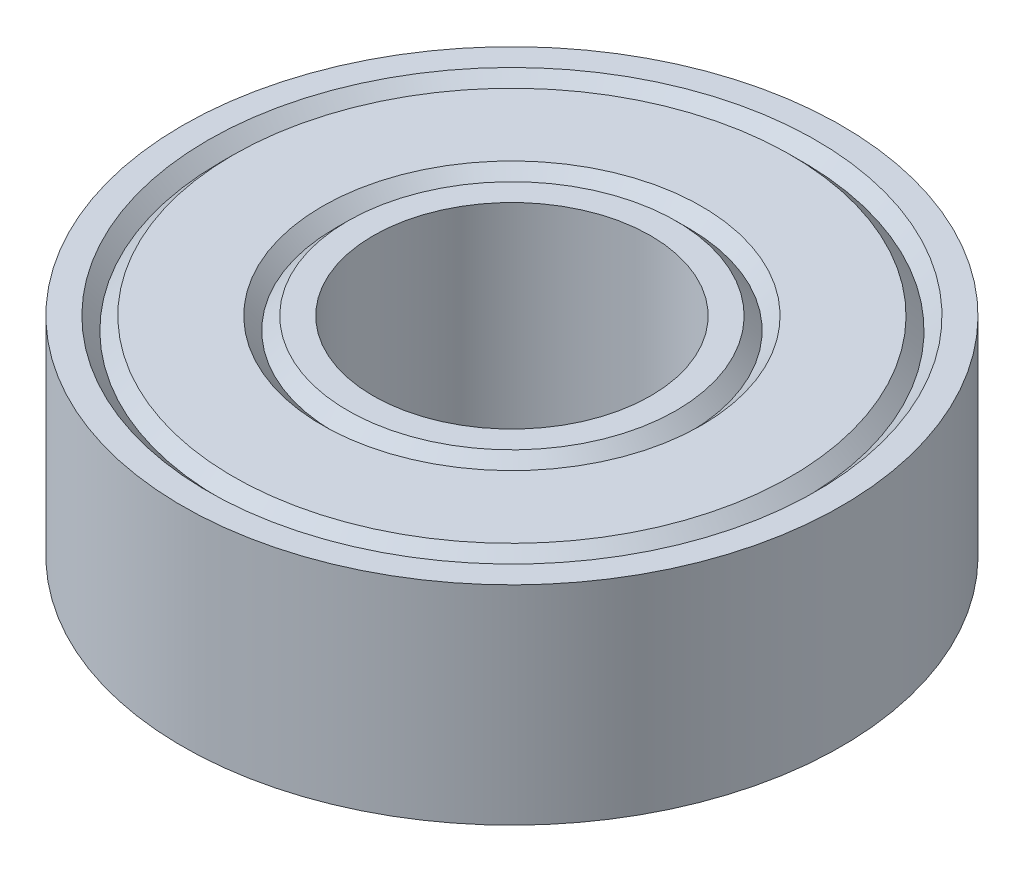
ISO-10303-21;
HEADER;
FILE_DESCRIPTION(('STEP AP214'),'2;1');
FILE_NAME('part.step','',(''),(''),'','','');
FILE_SCHEMA(('AUTOMOTIVE_DESIGN { 1 0 10303 214 1 1 1 1 }'));
ENDSEC;
DATA;
#1=APPLICATION_CONTEXT('core data for automotive mechanical design processes');
#2=APPLICATION_PROTOCOL_DEFINITION('international standard','automotive_design',2000,#1);
#3=PRODUCT_CONTEXT('',#1,'mechanical');
#4=PRODUCT('Part','Part','',(#3));
#5=PRODUCT_RELATED_PRODUCT_CATEGORY('part','',(#4));
#6=PRODUCT_DEFINITION_FORMATION('','',#4);
#7=PRODUCT_DEFINITION_CONTEXT('part definition',#1,'design');
#8=PRODUCT_DEFINITION('design','',#6,#7);
#9=PRODUCT_DEFINITION_SHAPE('','',#8);
#10=(LENGTH_UNIT() NAMED_UNIT(*) SI_UNIT(.MILLI.,.METRE.));
#11=(NAMED_UNIT(*) PLANE_ANGLE_UNIT() SI_UNIT($,.RADIAN.));
#12=(NAMED_UNIT(*) SI_UNIT($,.STERADIAN.) SOLID_ANGLE_UNIT());
#13=UNCERTAINTY_MEASURE_WITH_UNIT(LENGTH_MEASURE(1.E-05),#10,'distance_accuracy_value','');
#14=(GEOMETRIC_REPRESENTATION_CONTEXT(3) GLOBAL_UNCERTAINTY_ASSIGNED_CONTEXT((#13)) GLOBAL_UNIT_ASSIGNED_CONTEXT((#10,
#11,#12)) REPRESENTATION_CONTEXT('',''));
#15=CARTESIAN_POINT('',(0.,0.,0.));
#16=DIRECTION('',(0.,0.,1.));
#17=DIRECTION('',(1.,0.,0.));
#18=AXIS2_PLACEMENT_3D('',#15,#16,#17);
#19=CARTESIAN_POINT('',(0.,3.,0.));
#20=DIRECTION('',(0.,1.,0.));
#21=DIRECTION('',(-1.,0.,0.));
#22=AXIS2_PLACEMENT_3D('',#19,#20,#21);
#23=CYLINDRICAL_SURFACE('',#22,4.);
#24=CARTESIAN_POINT('',(0.,3.00000000000001,0.));
#25=DIRECTION('',(0.,1.,0.));
#26=DIRECTION('',(-1.,0.,0.));
#27=AXIS2_PLACEMENT_3D('',#24,#25,#26);
#28=CIRCLE('',#27,4.);
#29=CARTESIAN_POINT('',(-4.,3.,0.));
#30=VERTEX_POINT('',#29);
#31=EDGE_CURVE('E83',#30,#30,#28,.T.);
#32=ORIENTED_EDGE('',*,*,#31,.T.);
#33=EDGE_LOOP('',(#32));
#34=FACE_BOUND('',#33,.T.);
#35=CARTESIAN_POINT('',(0.,-3.,0.));
#36=DIRECTION('',(0.,1.,0.));
#37=DIRECTION('',(-1.,0.,0.));
#38=AXIS2_PLACEMENT_3D('',#35,#36,#37);
#39=CIRCLE('',#38,4.);
#40=CARTESIAN_POINT('',(-4.,-3.,0.));
#41=VERTEX_POINT('',#40);
#42=EDGE_CURVE('E10',#41,#41,#39,.T.);
#43=ORIENTED_EDGE('',*,*,#42,.F.);
#44=EDGE_LOOP('',(#43));
#45=FACE_BOUND('',#44,.T.);
#46=ADVANCED_FACE('F31',(#34,#45),#23,.F.);
#47=CARTESIAN_POINT('',(-4.,-3.,0.));
#48=DIRECTION('',(0.,-1.,0.));
#49=DIRECTION('',(1.,0.,0.));
#50=AXIS2_PLACEMENT_3D('',#47,#48,#49);
#51=PLANE('',#50);
#52=ORIENTED_EDGE('',*,*,#42,.T.);
#53=EDGE_LOOP('',(#52));
#54=FACE_BOUND('',#53,.T.);
#55=CARTESIAN_POINT('',(0.,-3.,0.));
#56=DIRECTION('',(0.,1.,0.));
#57=DIRECTION('',(-1.,0.,0.));
#58=AXIS2_PLACEMENT_3D('',#55,#56,#57);
#59=CIRCLE('',#58,4.73333333333334);
#60=CARTESIAN_POINT('',(-4.73333333333333,-3.,0.));
#61=VERTEX_POINT('',#60);
#62=EDGE_CURVE('E37',#61,#61,#59,.T.);
#63=ORIENTED_EDGE('',*,*,#62,.F.);
#64=EDGE_LOOP('',(#63));
#65=FACE_BOUND('',#64,.T.);
#66=ADVANCED_FACE('F101',(#54,#65),#51,.T.);
#67=CARTESIAN_POINT('',(0.,-2.63333333333333,0.));
#68=DIRECTION('',(0.,1.,0.));
#69=DIRECTION('',(-1.,0.,0.));
#70=AXIS2_PLACEMENT_3D('',#67,#68,#69);
#71=CONICAL_SURFACE('',#70,5.10000000000001,0.785398163397452);
#72=ORIENTED_EDGE('',*,*,#62,.T.);
#73=EDGE_LOOP('',(#72));
#74=FACE_BOUND('',#73,.T.);
#75=CARTESIAN_POINT('',(0.,-2.63333333333333,0.));
#76=DIRECTION('',(0.,1.,0.));
#77=DIRECTION('',(-1.,0.,0.));
#78=AXIS2_PLACEMENT_3D('',#75,#76,#77);
#79=CIRCLE('',#78,5.10000000000001);
#80=CARTESIAN_POINT('',(-5.1,-2.63333333333333,0.));
#81=VERTEX_POINT('',#80);
#82=EDGE_CURVE('E41',#81,#81,#79,.T.);
#83=ORIENTED_EDGE('',*,*,#82,.F.);
#84=EDGE_LOOP('',(#83));
#85=FACE_BOUND('',#84,.T.);
#86=ADVANCED_FACE('F105',(#74,#85),#71,.T.);
#87=CARTESIAN_POINT('',(0.,-3.,0.));
#88=DIRECTION('',(0.,-1.,0.));
#89=DIRECTION('',(1.,0.,0.));
#90=AXIS2_PLACEMENT_3D('',#87,#88,#89);
#91=CONICAL_SURFACE('',#90,5.46666666666667,0.78539816339745);
#92=ORIENTED_EDGE('',*,*,#82,.T.);
#93=EDGE_LOOP('',(#92));
#94=FACE_BOUND('',#93,.T.);
#95=CARTESIAN_POINT('',(0.,-3.,0.));
#96=DIRECTION('',(0.,1.,0.));
#97=DIRECTION('',(-1.,0.,0.));
#98=AXIS2_PLACEMENT_3D('',#95,#96,#97);
#99=CIRCLE('',#98,5.46666666666667);
#100=CARTESIAN_POINT('',(-5.46666666666667,-3.,0.));
#101=VERTEX_POINT('',#100);
#102=EDGE_CURVE('E45',#101,#101,#99,.T.);
#103=ORIENTED_EDGE('',*,*,#102,.F.);
#104=EDGE_LOOP('',(#103));
#105=FACE_BOUND('',#104,.T.);
#106=ADVANCED_FACE('F109',(#94,#105),#91,.F.);
#107=CARTESIAN_POINT('',(-5.46666666666667,-3.,0.));
#108=DIRECTION('',(0.,-1.,0.));
#109=DIRECTION('',(1.,0.,0.));
#110=AXIS2_PLACEMENT_3D('',#107,#108,#109);
#111=PLANE('',#110);
#112=ORIENTED_EDGE('',*,*,#102,.T.);
#113=EDGE_LOOP('',(#112));
#114=FACE_BOUND('',#113,.T.);
#115=CARTESIAN_POINT('',(0.,-3.,0.));
#116=DIRECTION('',(0.,1.,0.));
#117=DIRECTION('',(-1.,0.,0.));
#118=AXIS2_PLACEMENT_3D('',#115,#116,#117);
#119=CIRCLE('',#118,8.03333333333333);
#120=CARTESIAN_POINT('',(-8.03333333333333,-3.,0.));
#121=VERTEX_POINT('',#120);
#122=EDGE_CURVE('E50',#121,#121,#119,.T.);
#123=ORIENTED_EDGE('',*,*,#122,.F.);
#124=EDGE_LOOP('',(#123));
#125=FACE_BOUND('',#124,.T.);
#126=ADVANCED_FACE('F115',(#114,#125),#111,.T.);
#127=CARTESIAN_POINT('',(0.,-2.63333333333333,0.));
#128=DIRECTION('',(0.,1.,0.));
#129=DIRECTION('',(-1.,0.,0.));
#130=AXIS2_PLACEMENT_3D('',#127,#128,#129);
#131=CONICAL_SURFACE('',#130,8.4,0.78539816339745);
#132=ORIENTED_EDGE('',*,*,#122,.T.);
#133=EDGE_LOOP('',(#132));
#134=FACE_BOUND('',#133,.T.);
#135=CARTESIAN_POINT('',(0.,-2.63333333333333,0.));
#136=DIRECTION('',(0.,1.,0.));
#137=DIRECTION('',(-1.,0.,0.));
#138=AXIS2_PLACEMENT_3D('',#135,#136,#137);
#139=CIRCLE('',#138,8.4);
#140=CARTESIAN_POINT('',(-8.4,-2.63333333333333,0.));
#141=VERTEX_POINT('',#140);
#142=EDGE_CURVE('E53',#141,#141,#139,.T.);
#143=ORIENTED_EDGE('',*,*,#142,.F.);
#144=EDGE_LOOP('',(#143));
#145=FACE_BOUND('',#144,.T.);
#146=ADVANCED_FACE('F119',(#134,#145),#131,.T.);
#147=CARTESIAN_POINT('',(0.,-3.,0.));
#148=DIRECTION('',(0.,-1.,0.));
#149=DIRECTION('',(1.,0.,0.));
#150=AXIS2_PLACEMENT_3D('',#147,#148,#149);
#151=CONICAL_SURFACE('',#150,8.76666666666667,0.785398163397447);
#152=ORIENTED_EDGE('',*,*,#142,.T.);
#153=EDGE_LOOP('',(#152));
#154=FACE_BOUND('',#153,.T.);
#155=CARTESIAN_POINT('',(0.,-3.,0.));
#156=DIRECTION('',(0.,1.,0.));
#157=DIRECTION('',(-1.,0.,0.));
#158=AXIS2_PLACEMENT_3D('',#155,#156,#157);
#159=CIRCLE('',#158,8.76666666666667);
#160=CARTESIAN_POINT('',(-8.76666666666667,-3.,0.));
#161=VERTEX_POINT('',#160);
#162=EDGE_CURVE('E56',#161,#161,#159,.T.);
#163=ORIENTED_EDGE('',*,*,#162,.F.);
#164=EDGE_LOOP('',(#163));
#165=FACE_BOUND('',#164,.T.);
#166=ADVANCED_FACE('F123',(#154,#165),#151,.F.);
#167=CARTESIAN_POINT('',(-8.76666666666667,-3.,0.));
#168=DIRECTION('',(0.,-1.,0.));
#169=DIRECTION('',(1.,0.,0.));
#170=AXIS2_PLACEMENT_3D('',#167,#168,#169);
#171=PLANE('',#170);
#172=ORIENTED_EDGE('',*,*,#162,.T.);
#173=EDGE_LOOP('',(#172));
#174=FACE_BOUND('',#173,.T.);
#175=CARTESIAN_POINT('',(0.,-3.,0.));
#176=DIRECTION('',(0.,1.,0.));
#177=DIRECTION('',(-1.,0.,0.));
#178=AXIS2_PLACEMENT_3D('',#175,#176,#177);
#179=CIRCLE('',#178,9.5);
#180=CARTESIAN_POINT('',(-9.5,-3.,0.));
#181=VERTEX_POINT('',#180);
#182=EDGE_CURVE('E59',#181,#181,#179,.T.);
#183=ORIENTED_EDGE('',*,*,#182,.F.);
#184=EDGE_LOOP('',(#183));
#185=FACE_BOUND('',#184,.T.);
#186=ADVANCED_FACE('F127',(#174,#185),#171,.T.);
#187=CARTESIAN_POINT('',(0.,3.,0.));
#188=DIRECTION('',(0.,1.,0.));
#189=DIRECTION('',(-1.,0.,0.));
#190=AXIS2_PLACEMENT_3D('',#187,#188,#189);
#191=CYLINDRICAL_SURFACE('',#190,9.5);
#192=ORIENTED_EDGE('',*,*,#182,.T.);
#193=EDGE_LOOP('',(#192));
#194=FACE_BOUND('',#193,.T.);
#195=CARTESIAN_POINT('',(0.,3.,0.));
#196=DIRECTION('',(0.,1.,0.));
#197=DIRECTION('',(-1.,0.,0.));
#198=AXIS2_PLACEMENT_3D('',#195,#196,#197);
#199=CIRCLE('',#198,9.5);
#200=CARTESIAN_POINT('',(-9.5,3.,0.));
#201=VERTEX_POINT('',#200);
#202=EDGE_CURVE('E62',#201,#201,#199,.T.);
#203=ORIENTED_EDGE('',*,*,#202,.F.);
#204=EDGE_LOOP('',(#203));
#205=FACE_BOUND('',#204,.T.);
#206=ADVANCED_FACE('F131',(#194,#205),#191,.T.);
#207=CARTESIAN_POINT('',(-8.76666666666667,3.,0.));
#208=DIRECTION('',(0.,1.,0.));
#209=DIRECTION('',(-1.,0.,0.));
#210=AXIS2_PLACEMENT_3D('',#207,#208,#209);
#211=PLANE('',#210);
#212=ORIENTED_EDGE('',*,*,#202,.T.);
#213=EDGE_LOOP('',(#212));
#214=FACE_BOUND('',#213,.T.);
#215=CARTESIAN_POINT('',(0.,3.,0.));
#216=DIRECTION('',(0.,1.,0.));
#217=DIRECTION('',(-1.,0.,0.));
#218=AXIS2_PLACEMENT_3D('',#215,#216,#217);
#219=CIRCLE('',#218,8.76666666666667);
#220=CARTESIAN_POINT('',(-8.76666666666667,3.,0.));
#221=VERTEX_POINT('',#220);
#222=EDGE_CURVE('E65',#221,#221,#219,.T.);
#223=ORIENTED_EDGE('',*,*,#222,.F.);
#224=EDGE_LOOP('',(#223));
#225=FACE_BOUND('',#224,.T.);
#226=ADVANCED_FACE('F135',(#214,#225),#211,.T.);
#227=CARTESIAN_POINT('',(0.,2.63333333333334,0.));
#228=DIRECTION('',(0.,1.,0.));
#229=DIRECTION('',(-1.,0.,0.));
#230=AXIS2_PLACEMENT_3D('',#227,#228,#229);
#231=CONICAL_SURFACE('',#230,8.40000000000001,0.785398163397442);
#232=ORIENTED_EDGE('',*,*,#222,.T.);
#233=EDGE_LOOP('',(#232));
#234=FACE_BOUND('',#233,.T.);
#235=CARTESIAN_POINT('',(0.,2.63333333333334,0.));
#236=DIRECTION('',(0.,1.,0.));
#237=DIRECTION('',(-1.,0.,0.));
#238=AXIS2_PLACEMENT_3D('',#235,#236,#237);
#239=CIRCLE('',#238,8.40000000000001);
#240=CARTESIAN_POINT('',(-8.4,2.63333333333333,0.));
#241=VERTEX_POINT('',#240);
#242=EDGE_CURVE('E68',#241,#241,#239,.T.);
#243=ORIENTED_EDGE('',*,*,#242,.F.);
#244=EDGE_LOOP('',(#243));
#245=FACE_BOUND('',#244,.T.);
#246=ADVANCED_FACE('F139',(#234,#245),#231,.F.);
#247=CARTESIAN_POINT('',(0.,3.00000000000001,0.));
#248=DIRECTION('',(0.,-1.,0.));
#249=DIRECTION('',(1.,0.,0.));
#250=AXIS2_PLACEMENT_3D('',#247,#248,#249);
#251=CONICAL_SURFACE('',#250,8.03333333333333,0.785398163397457);
#252=ORIENTED_EDGE('',*,*,#242,.T.);
#253=EDGE_LOOP('',(#252));
#254=FACE_BOUND('',#253,.T.);
#255=CARTESIAN_POINT('',(0.,3.00000000000001,0.));
#256=DIRECTION('',(0.,1.,0.));
#257=DIRECTION('',(-1.,0.,0.));
#258=AXIS2_PLACEMENT_3D('',#255,#256,#257);
#259=CIRCLE('',#258,8.03333333333333);
#260=CARTESIAN_POINT('',(-8.03333333333333,3.,0.));
#261=VERTEX_POINT('',#260);
#262=EDGE_CURVE('E71',#261,#261,#259,.T.);
#263=ORIENTED_EDGE('',*,*,#262,.F.);
#264=EDGE_LOOP('',(#263));
#265=FACE_BOUND('',#264,.T.);
#266=ADVANCED_FACE('F143',(#254,#265),#251,.T.);
#267=CARTESIAN_POINT('',(-5.46666666666667,3.,0.));
#268=DIRECTION('',(0.,1.,0.));
#269=DIRECTION('',(-1.,0.,0.));
#270=AXIS2_PLACEMENT_3D('',#267,#268,#269);
#271=PLANE('',#270);
#272=ORIENTED_EDGE('',*,*,#262,.T.);
#273=EDGE_LOOP('',(#272));
#274=FACE_BOUND('',#273,.T.);
#275=CARTESIAN_POINT('',(0.,3.,0.));
#276=DIRECTION('',(0.,1.,0.));
#277=DIRECTION('',(-1.,0.,0.));
#278=AXIS2_PLACEMENT_3D('',#275,#276,#277);
#279=CIRCLE('',#278,5.46666666666667);
#280=CARTESIAN_POINT('',(-5.46666666666667,3.,0.));
#281=VERTEX_POINT('',#280);
#282=EDGE_CURVE('E74',#281,#281,#279,.T.);
#283=ORIENTED_EDGE('',*,*,#282,.F.);
#284=EDGE_LOOP('',(#283));
#285=FACE_BOUND('',#284,.T.);
#286=ADVANCED_FACE('F147',(#274,#285),#271,.T.);
#287=CARTESIAN_POINT('',(0.,2.63333333333333,0.));
#288=DIRECTION('',(0.,1.,0.));
#289=DIRECTION('',(-1.,0.,0.));
#290=AXIS2_PLACEMENT_3D('',#287,#288,#289);
#291=CONICAL_SURFACE('',#290,5.1,0.78539816339745);
#292=ORIENTED_EDGE('',*,*,#282,.T.);
#293=EDGE_LOOP('',(#292));
#294=FACE_BOUND('',#293,.T.);
#295=CARTESIAN_POINT('',(0.,2.63333333333333,0.));
#296=DIRECTION('',(0.,1.,0.));
#297=DIRECTION('',(-1.,0.,0.));
#298=AXIS2_PLACEMENT_3D('',#295,#296,#297);
#299=CIRCLE('',#298,5.1);
#300=CARTESIAN_POINT('',(-5.1,2.63333333333333,0.));
#301=VERTEX_POINT('',#300);
#302=EDGE_CURVE('E77',#301,#301,#299,.T.);
#303=ORIENTED_EDGE('',*,*,#302,.F.);
#304=EDGE_LOOP('',(#303));
#305=FACE_BOUND('',#304,.T.);
#306=ADVANCED_FACE('F97',(#294,#305),#291,.F.);
#307=CARTESIAN_POINT('',(0.,3.,0.));
#308=DIRECTION('',(0.,-1.,0.));
#309=DIRECTION('',(1.,0.,0.));
#310=AXIS2_PLACEMENT_3D('',#307,#308,#309);
#311=CONICAL_SURFACE('',#310,4.73333333333334,0.785398163397451);
#312=ORIENTED_EDGE('',*,*,#302,.T.);
#313=EDGE_LOOP('',(#312));
#314=FACE_BOUND('',#313,.T.);
#315=CARTESIAN_POINT('',(0.,3.,0.));
#316=DIRECTION('',(0.,1.,0.));
#317=DIRECTION('',(-1.,0.,0.));
#318=AXIS2_PLACEMENT_3D('',#315,#316,#317);
#319=CIRCLE('',#318,4.73333333333334);
#320=CARTESIAN_POINT('',(-4.73333333333334,3.,0.));
#321=VERTEX_POINT('',#320);
#322=EDGE_CURVE('E80',#321,#321,#319,.T.);
#323=ORIENTED_EDGE('',*,*,#322,.F.);
#324=EDGE_LOOP('',(#323));
#325=FACE_BOUND('',#324,.T.);
#326=ADVANCED_FACE('F91',(#314,#325),#311,.T.);
#327=CARTESIAN_POINT('',(-4.,3.,0.));
#328=DIRECTION('',(0.,1.,0.));
#329=DIRECTION('',(-1.,0.,0.));
#330=AXIS2_PLACEMENT_3D('',#327,#328,#329);
#331=PLANE('',#330);
#332=ORIENTED_EDGE('',*,*,#322,.T.);
#333=EDGE_LOOP('',(#332));
#334=FACE_BOUND('',#333,.T.);
#335=ORIENTED_EDGE('',*,*,#31,.F.);
#336=EDGE_LOOP('',(#335));
#337=FACE_BOUND('',#336,.T.);
#338=ADVANCED_FACE('F89',(#334,#337),#331,.T.);
#339=CLOSED_SHELL('',(#46,#66,#86,#106,#126,#146,#166,#186,#206,#226,#246,#266,#286,#306,#326,#338));
#340=MANIFOLD_SOLID_BREP('B2',#339);
#341=ADVANCED_BREP_SHAPE_REPRESENTATION('',(#18,#340),#14);
#342=SHAPE_DEFINITION_REPRESENTATION(#9,#341);
ENDSEC;
END-ISO-10303-21;
